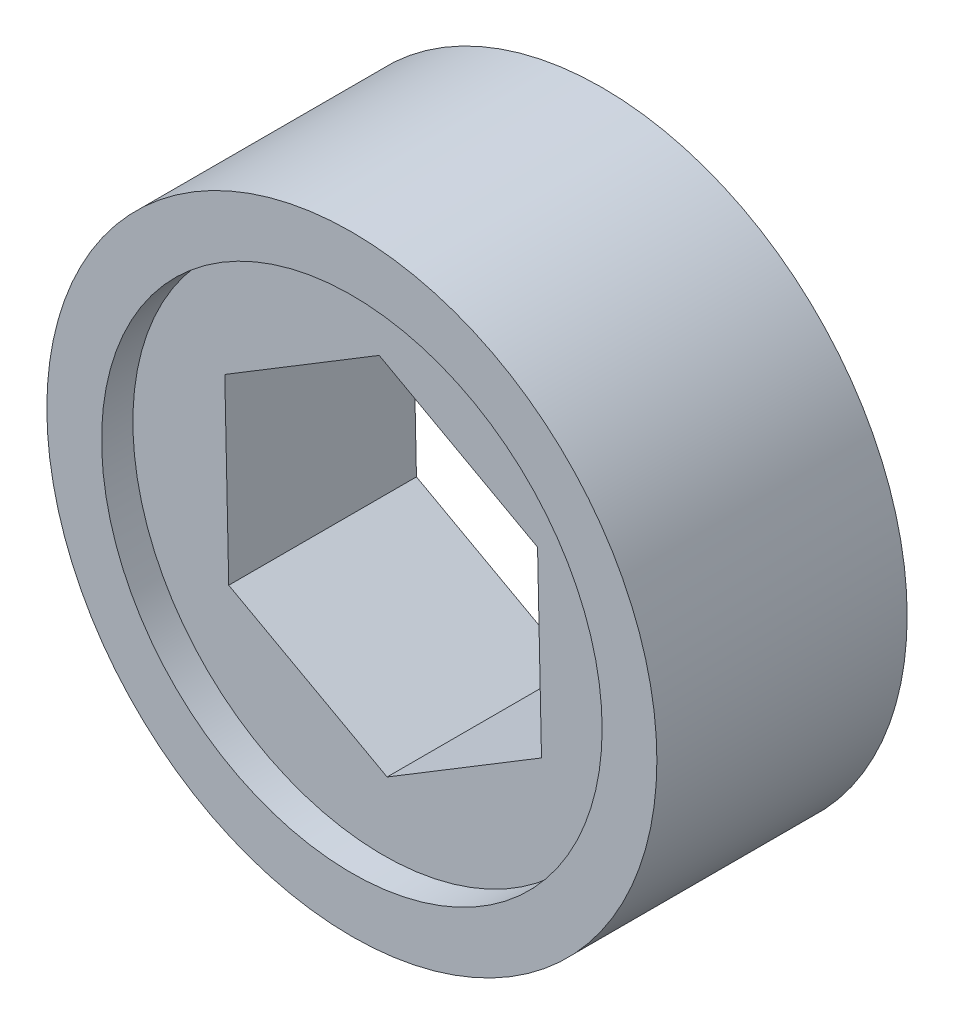
ISO-10303-21;
HEADER;
FILE_DESCRIPTION(('STEP AP214'),'2;1');
FILE_NAME('part.step','',(''),(''),'','','');
FILE_SCHEMA(('AUTOMOTIVE_DESIGN { 1 0 10303 214 1 1 1 1 }'));
ENDSEC;
DATA;
#1=APPLICATION_CONTEXT('core data for automotive mechanical design processes');
#2=APPLICATION_PROTOCOL_DEFINITION('international standard','automotive_design',2000,#1);
#3=PRODUCT_CONTEXT('',#1,'mechanical');
#4=PRODUCT('Part','Part','',(#3));
#5=PRODUCT_RELATED_PRODUCT_CATEGORY('part','',(#4));
#6=PRODUCT_DEFINITION_FORMATION('','',#4);
#7=PRODUCT_DEFINITION_CONTEXT('part definition',#1,'design');
#8=PRODUCT_DEFINITION('design','',#6,#7);
#9=PRODUCT_DEFINITION_SHAPE('','',#8);
#10=(LENGTH_UNIT() NAMED_UNIT(*) SI_UNIT(.MILLI.,.METRE.));
#11=(NAMED_UNIT(*) PLANE_ANGLE_UNIT() SI_UNIT($,.RADIAN.));
#12=(NAMED_UNIT(*) SI_UNIT($,.STERADIAN.) SOLID_ANGLE_UNIT());
#13=UNCERTAINTY_MEASURE_WITH_UNIT(LENGTH_MEASURE(1.E-05),#10,'distance_accuracy_value','');
#14=(GEOMETRIC_REPRESENTATION_CONTEXT(3) GLOBAL_UNCERTAINTY_ASSIGNED_CONTEXT((#13)) GLOBAL_UNIT_ASSIGNED_CONTEXT((#10,
#11,#12)) REPRESENTATION_CONTEXT('',''));
#15=CARTESIAN_POINT('',(0.,0.,0.));
#16=DIRECTION('',(0.,0.,1.));
#17=DIRECTION('',(1.,0.,0.));
#18=AXIS2_PLACEMENT_3D('',#15,#16,#17);
#19=CARTESIAN_POINT('',(-6.26830506406704,-3.80416678881528,10.16));
#20=DIRECTION('',(0.480941143051451,0.876752882470519,0.));
#21=DIRECTION('',(-0.876752882470519,0.480941143051451,0.));
#22=AXIS2_PLACEMENT_3D('',#19,#20,#21);
#23=PLANE('',#22);
#24=DIRECTION('',(0.,0.,-1.));
#25=VECTOR('',#24,1.);
#26=CARTESIAN_POINT('',(0.160352547313589,-7.33059481856034,10.16));
#27=LINE('',#26,#25);
#28=CARTESIAN_POINT('',(0.160352547313589,-7.33059481856034,8.89));
#29=VERTEX_POINT('',#28);
#30=CARTESIAN_POINT('',(0.160352547313589,-7.33059481856034,1.27));
#31=VERTEX_POINT('',#30);
#32=EDGE_CURVE('E96',#29,#31,#27,.T.);
#33=ORIENTED_EDGE('',*,*,#32,.T.);
#34=DIRECTION('',(-0.876752882470519,0.480941143051451,0.));
#35=VECTOR('',#34,1.);
#36=CARTESIAN_POINT('',(-6.26830506406704,-3.80416678881528,1.27));
#37=LINE('',#36,#35);
#38=CARTESIAN_POINT('',(-6.26830506406704,-3.80416678881528,1.27));
#39=VERTEX_POINT('',#38);
#40=EDGE_CURVE('E85',#31,#39,#37,.T.);
#41=ORIENTED_EDGE('',*,*,#40,.T.);
#42=DIRECTION('',(0.,0.,-1.));
#43=VECTOR('',#42,1.);
#44=CARTESIAN_POINT('',(-6.26830506406704,-3.80416678881528,10.16));
#45=LINE('',#44,#43);
#46=CARTESIAN_POINT('',(-6.26830506406704,-3.80416678881528,8.89));
#47=VERTEX_POINT('',#46);
#48=EDGE_CURVE('E94',#47,#39,#45,.T.);
#49=ORIENTED_EDGE('',*,*,#48,.F.);
#50=DIRECTION('',(0.876752882470519,-0.480941143051451,0.));
#51=VECTOR('',#50,1.);
#52=CARTESIAN_POINT('',(-6.26830506406704,-3.80416678881528,8.89));
#53=LINE('',#52,#51);
#54=EDGE_CURVE('E55',#47,#29,#53,.T.);
#55=ORIENTED_EDGE('',*,*,#54,.T.);
#56=EDGE_LOOP('',(#33,#41,#49,#55));
#57=FACE_BOUND('',#56,.T.);
#58=ADVANCED_FACE('F33',(#57),#23,.T.);
#59=CARTESIAN_POINT('',(0.160352547313589,-7.33059481856034,10.16));
#60=DIRECTION('',(-0.518819697534976,0.854883688842942,0.));
#61=DIRECTION('',(-0.854883688842942,-0.518819697534976,0.));
#62=AXIS2_PLACEMENT_3D('',#59,#60,#61);
#63=PLANE('',#62);
#64=DIRECTION('',(0.,0.,-1.));
#65=VECTOR('',#64,1.);
#66=CARTESIAN_POINT('',(6.42865761138062,-3.52642802974505,10.16));
#67=LINE('',#66,#65);
#68=CARTESIAN_POINT('',(6.42865761138062,-3.52642802974505,8.89));
#69=VERTEX_POINT('',#68);
#70=CARTESIAN_POINT('',(6.42865761138062,-3.52642802974505,1.27));
#71=VERTEX_POINT('',#70);
#72=EDGE_CURVE('E114',#69,#71,#67,.T.);
#73=ORIENTED_EDGE('',*,*,#72,.T.);
#74=DIRECTION('',(-0.854883688842942,-0.518819697534976,0.));
#75=VECTOR('',#74,1.);
#76=CARTESIAN_POINT('',(0.160352547313589,-7.33059481856034,1.27));
#77=LINE('',#76,#75);
#78=EDGE_CURVE('E98',#71,#31,#77,.T.);
#79=ORIENTED_EDGE('',*,*,#78,.T.);
#80=ORIENTED_EDGE('',*,*,#32,.F.);
#81=DIRECTION('',(0.854883688842942,0.518819697534976,0.));
#82=VECTOR('',#81,1.);
#83=CARTESIAN_POINT('',(0.160352547313589,-7.33059481856034,8.89));
#84=LINE('',#83,#82);
#85=EDGE_CURVE('E105',#29,#69,#84,.T.);
#86=ORIENTED_EDGE('',*,*,#85,.T.);
#87=EDGE_LOOP('',(#73,#79,#80,#86));
#88=FACE_BOUND('',#87,.T.);
#89=ADVANCED_FACE('F140',(#88),#63,.T.);
#90=CARTESIAN_POINT('',(6.42865761138062,-3.52642802974505,10.16));
#91=DIRECTION('',(-0.999760840586427,-0.0218691936275774,0.));
#92=DIRECTION('',(0.0218691936275774,-0.999760840586427,0.));
#93=AXIS2_PLACEMENT_3D('',#90,#91,#92);
#94=PLANE('',#93);
#95=DIRECTION('',(0.,0.,-1.));
#96=VECTOR('',#95,1.);
#97=CARTESIAN_POINT('',(6.26830506406703,3.80416678881529,10.16));
#98=LINE('',#97,#96);
#99=CARTESIAN_POINT('',(6.26830506406703,3.80416678881529,8.89));
#100=VERTEX_POINT('',#99);
#101=CARTESIAN_POINT('',(6.26830506406703,3.80416678881529,1.27));
#102=VERTEX_POINT('',#101);
#103=EDGE_CURVE('E111',#100,#102,#98,.T.);
#104=ORIENTED_EDGE('',*,*,#103,.T.);
#105=DIRECTION('',(0.0218691936275774,-0.999760840586427,0.));
#106=VECTOR('',#105,1.);
#107=CARTESIAN_POINT('',(6.42865761138062,-3.52642802974505,1.27));
#108=LINE('',#107,#106);
#109=EDGE_CURVE('E260',#102,#71,#108,.T.);
#110=ORIENTED_EDGE('',*,*,#109,.T.);
#111=ORIENTED_EDGE('',*,*,#72,.F.);
#112=DIRECTION('',(-0.0218691936275774,0.999760840586427,0.));
#113=VECTOR('',#112,1.);
#114=CARTESIAN_POINT('',(6.42865761138062,-3.52642802974505,8.89));
#115=LINE('',#114,#113);
#116=EDGE_CURVE('E275',#69,#100,#115,.T.);
#117=ORIENTED_EDGE('',*,*,#116,.T.);
#118=EDGE_LOOP('',(#104,#110,#111,#117));
#119=FACE_BOUND('',#118,.T.);
#120=ADVANCED_FACE('F145',(#119),#94,.T.);
#121=CARTESIAN_POINT('',(6.26830506406703,3.80416678881529,10.16));
#122=DIRECTION('',(-0.480941143051451,-0.876752882470519,0.));
#123=DIRECTION('',(0.876752882470519,-0.480941143051451,0.));
#124=AXIS2_PLACEMENT_3D('',#121,#122,#123);
#125=PLANE('',#124);
#126=DIRECTION('',(0.,0.,-1.));
#127=VECTOR('',#126,1.);
#128=CARTESIAN_POINT('',(-0.160352547313591,7.33059481856034,10.16));
#129=LINE('',#128,#127);
#130=CARTESIAN_POINT('',(-0.160352547313591,7.33059481856034,8.89));
#131=VERTEX_POINT('',#130);
#132=CARTESIAN_POINT('',(-0.160352547313591,7.33059481856034,1.27));
#133=VERTEX_POINT('',#132);
#134=EDGE_CURVE('E103',#131,#133,#129,.T.);
#135=ORIENTED_EDGE('',*,*,#134,.T.);
#136=DIRECTION('',(0.876752882470519,-0.480941143051451,0.));
#137=VECTOR('',#136,1.);
#138=CARTESIAN_POINT('',(6.26830506406703,3.80416678881529,1.27));
#139=LINE('',#138,#137);
#140=EDGE_CURVE('E257',#133,#102,#139,.T.);
#141=ORIENTED_EDGE('',*,*,#140,.T.);
#142=ORIENTED_EDGE('',*,*,#103,.F.);
#143=DIRECTION('',(-0.876752882470519,0.480941143051451,0.));
#144=VECTOR('',#143,1.);
#145=CARTESIAN_POINT('',(6.26830506406703,3.80416678881529,8.89));
#146=LINE('',#145,#144);
#147=EDGE_CURVE('E272',#100,#131,#146,.T.);
#148=ORIENTED_EDGE('',*,*,#147,.T.);
#149=EDGE_LOOP('',(#135,#141,#142,#148));
#150=FACE_BOUND('',#149,.T.);
#151=ADVANCED_FACE('F151',(#150),#125,.T.);
#152=CARTESIAN_POINT('',(-0.160352547313591,7.33059481856034,10.16));
#153=DIRECTION('',(0.518819697534976,-0.854883688842942,0.));
#154=DIRECTION('',(0.854883688842942,0.518819697534976,0.));
#155=AXIS2_PLACEMENT_3D('',#152,#153,#154);
#156=PLANE('',#155);
#157=DIRECTION('',(0.,0.,-1.));
#158=VECTOR('',#157,1.);
#159=CARTESIAN_POINT('',(-6.42865761138063,3.52642802974505,10.16));
#160=LINE('',#159,#158);
#161=CARTESIAN_POINT('',(-6.42865761138063,3.52642802974505,8.89));
#162=VERTEX_POINT('',#161);
#163=CARTESIAN_POINT('',(-6.42865761138063,3.52642802974505,1.27));
#164=VERTEX_POINT('',#163);
#165=EDGE_CURVE('E101',#162,#164,#160,.T.);
#166=ORIENTED_EDGE('',*,*,#165,.T.);
#167=DIRECTION('',(0.854883688842942,0.518819697534976,0.));
#168=VECTOR('',#167,1.);
#169=CARTESIAN_POINT('',(-0.160352547313591,7.33059481856034,1.27));
#170=LINE('',#169,#168);
#171=EDGE_CURVE('E48',#164,#133,#170,.T.);
#172=ORIENTED_EDGE('',*,*,#171,.T.);
#173=ORIENTED_EDGE('',*,*,#134,.F.);
#174=DIRECTION('',(-0.854883688842942,-0.518819697534976,0.));
#175=VECTOR('',#174,1.);
#176=CARTESIAN_POINT('',(-0.160352547313591,7.33059481856034,8.89));
#177=LINE('',#176,#175);
#178=EDGE_CURVE('E267',#131,#162,#177,.T.);
#179=ORIENTED_EDGE('',*,*,#178,.T.);
#180=EDGE_LOOP('',(#166,#172,#173,#179));
#181=FACE_BOUND('',#180,.T.);
#182=ADVANCED_FACE('F155',(#181),#156,.T.);
#183=CARTESIAN_POINT('',(-6.42865761138063,3.52642802974505,10.16));
#184=DIRECTION('',(0.999760840586427,0.0218691936275773,0.));
#185=DIRECTION('',(-0.0218691936275773,0.999760840586427,0.));
#186=AXIS2_PLACEMENT_3D('',#183,#184,#185);
#187=PLANE('',#186);
#188=ORIENTED_EDGE('',*,*,#48,.T.);
#189=DIRECTION('',(-0.0218691936275773,0.999760840586427,0.));
#190=VECTOR('',#189,1.);
#191=CARTESIAN_POINT('',(-6.42865761138063,3.52642802974505,1.27));
#192=LINE('',#191,#190);
#193=EDGE_CURVE('E11',#39,#164,#192,.T.);
#194=ORIENTED_EDGE('',*,*,#193,.T.);
#195=ORIENTED_EDGE('',*,*,#165,.F.);
#196=DIRECTION('',(0.0218691936275773,-0.999760840586427,0.));
#197=VECTOR('',#196,1.);
#198=CARTESIAN_POINT('',(-6.42865761138063,3.52642802974505,8.89));
#199=LINE('',#198,#197);
#200=EDGE_CURVE('E41',#162,#47,#199,.T.);
#201=ORIENTED_EDGE('',*,*,#200,.T.);
#202=EDGE_LOOP('',(#188,#194,#195,#201));
#203=FACE_BOUND('',#202,.T.);
#204=ADVANCED_FACE('F100',(#203),#187,.T.);
#205=CARTESIAN_POINT('',(0.,0.,10.16));
#206=DIRECTION('',(0.,0.,1.));
#207=DIRECTION('',(1.,0.,0.));
#208=AXIS2_PLACEMENT_3D('',#205,#206,#207);
#209=PLANE('',#208);
#210=CARTESIAN_POINT('',(0.,0.,10.16));
#211=DIRECTION('',(0.,0.,1.));
#212=DIRECTION('',(1.,0.,0.));
#213=AXIS2_PLACEMENT_3D('',#210,#211,#212);
#214=CIRCLE('',#213,10.16);
#215=CARTESIAN_POINT('',(10.16,0.,10.16));
#216=VERTEX_POINT('',#215);
#217=EDGE_CURVE('E97',#216,#216,#214,.T.);
#218=ORIENTED_EDGE('',*,*,#217,.F.);
#219=EDGE_LOOP('',(#218));
#220=FACE_BOUND('',#219,.T.);
#221=CARTESIAN_POINT('',(0.,0.,10.16));
#222=DIRECTION('',(0.,0.,1.));
#223=DIRECTION('',(1.,0.,0.));
#224=AXIS2_PLACEMENT_3D('',#221,#222,#223);
#225=CIRCLE('',#224,12.3825);
#226=CARTESIAN_POINT('',(12.3825,0.,10.16));
#227=VERTEX_POINT('',#226);
#228=EDGE_CURVE('E119',#227,#227,#225,.T.);
#229=ORIENTED_EDGE('',*,*,#228,.T.);
#230=EDGE_LOOP('',(#229));
#231=FACE_BOUND('',#230,.T.);
#232=ADVANCED_FACE('F128',(#220,#231),#209,.T.);
#233=CARTESIAN_POINT('',(0.,0.,0.));
#234=DIRECTION('',(0.,0.,1.));
#235=DIRECTION('',(1.,0.,0.));
#236=AXIS2_PLACEMENT_3D('',#233,#234,#235);
#237=PLANE('',#236);
#238=CARTESIAN_POINT('',(0.,0.,0.));
#239=DIRECTION('',(0.,0.,-1.));
#240=DIRECTION('',(-1.,0.,0.));
#241=AXIS2_PLACEMENT_3D('',#238,#239,#240);
#242=CIRCLE('',#241,10.16);
#243=CARTESIAN_POINT('',(-10.16,0.,0.));
#244=VERTEX_POINT('',#243);
#245=EDGE_CURVE('E252',#244,#244,#242,.T.);
#246=ORIENTED_EDGE('',*,*,#245,.F.);
#247=EDGE_LOOP('',(#246));
#248=FACE_BOUND('',#247,.T.);
#249=CARTESIAN_POINT('',(0.,0.,0.));
#250=DIRECTION('',(0.,0.,1.));
#251=DIRECTION('',(1.,0.,0.));
#252=AXIS2_PLACEMENT_3D('',#249,#250,#251);
#253=CIRCLE('',#252,12.3825);
#254=CARTESIAN_POINT('',(12.3825,0.,0.));
#255=VERTEX_POINT('',#254);
#256=EDGE_CURVE('E118',#255,#255,#253,.T.);
#257=ORIENTED_EDGE('',*,*,#256,.F.);
#258=EDGE_LOOP('',(#257));
#259=FACE_BOUND('',#258,.T.);
#260=ADVANCED_FACE('F126',(#248,#259),#237,.F.);
#261=CARTESIAN_POINT('',(0.,0.,10.16));
#262=DIRECTION('',(0.,0.,-1.));
#263=DIRECTION('',(-1.,0.,0.));
#264=AXIS2_PLACEMENT_3D('',#261,#262,#263);
#265=CYLINDRICAL_SURFACE('',#264,12.3825);
#266=ORIENTED_EDGE('',*,*,#228,.F.);
#267=EDGE_LOOP('',(#266));
#268=FACE_BOUND('',#267,.T.);
#269=ORIENTED_EDGE('',*,*,#256,.T.);
#270=EDGE_LOOP('',(#269));
#271=FACE_BOUND('',#270,.T.);
#272=ADVANCED_FACE('F35',(#268,#271),#265,.T.);
#273=CARTESIAN_POINT('',(0.,0.,8.89));
#274=DIRECTION('',(0.,0.,1.));
#275=DIRECTION('',(1.,0.,0.));
#276=AXIS2_PLACEMENT_3D('',#273,#274,#275);
#277=CYLINDRICAL_SURFACE('',#276,10.16);
#278=CARTESIAN_POINT('',(0.,0.,8.89));
#279=DIRECTION('',(0.,0.,1.));
#280=DIRECTION('',(1.,0.,0.));
#281=AXIS2_PLACEMENT_3D('',#278,#279,#280);
#282=CIRCLE('',#281,10.16);
#283=CARTESIAN_POINT('',(10.16,0.,8.89));
#284=VERTEX_POINT('',#283);
#285=EDGE_CURVE('E264',#284,#284,#282,.T.);
#286=ORIENTED_EDGE('',*,*,#285,.F.);
#287=EDGE_LOOP('',(#286));
#288=FACE_BOUND('',#287,.T.);
#289=ORIENTED_EDGE('',*,*,#217,.T.);
#290=EDGE_LOOP('',(#289));
#291=FACE_BOUND('',#290,.T.);
#292=ADVANCED_FACE('F134',(#288,#291),#277,.F.);
#293=CARTESIAN_POINT('',(0.,0.,8.89));
#294=DIRECTION('',(0.,0.,1.));
#295=DIRECTION('',(1.,0.,0.));
#296=AXIS2_PLACEMENT_3D('',#293,#294,#295);
#297=PLANE('',#296);
#298=ORIENTED_EDGE('',*,*,#200,.F.);
#299=ORIENTED_EDGE('',*,*,#178,.F.);
#300=ORIENTED_EDGE('',*,*,#147,.F.);
#301=ORIENTED_EDGE('',*,*,#116,.F.);
#302=ORIENTED_EDGE('',*,*,#85,.F.);
#303=ORIENTED_EDGE('',*,*,#54,.F.);
#304=EDGE_LOOP('',(#298,#299,#300,#301,#302,#303));
#305=FACE_BOUND('',#304,.T.);
#306=ORIENTED_EDGE('',*,*,#285,.T.);
#307=EDGE_LOOP('',(#306));
#308=FACE_BOUND('',#307,.T.);
#309=ADVANCED_FACE('F164',(#305,#308),#297,.T.);
#310=CARTESIAN_POINT('',(0.,0.,1.27));
#311=DIRECTION('',(0.,0.,-1.));
#312=DIRECTION('',(-1.,0.,0.));
#313=AXIS2_PLACEMENT_3D('',#310,#311,#312);
#314=CYLINDRICAL_SURFACE('',#313,10.16);
#315=CARTESIAN_POINT('',(0.,0.,1.27));
#316=DIRECTION('',(0.,0.,-1.));
#317=DIRECTION('',(-1.,0.,0.));
#318=AXIS2_PLACEMENT_3D('',#315,#316,#317);
#319=CIRCLE('',#318,10.16);
#320=CARTESIAN_POINT('',(-10.16,0.,1.27));
#321=VERTEX_POINT('',#320);
#322=EDGE_CURVE('E250',#321,#321,#319,.T.);
#323=ORIENTED_EDGE('',*,*,#322,.F.);
#324=EDGE_LOOP('',(#323));
#325=FACE_BOUND('',#324,.T.);
#326=ORIENTED_EDGE('',*,*,#245,.T.);
#327=EDGE_LOOP('',(#326));
#328=FACE_BOUND('',#327,.T.);
#329=ADVANCED_FACE('F168',(#325,#328),#314,.F.);
#330=CARTESIAN_POINT('',(0.,0.,1.27));
#331=DIRECTION('',(0.,0.,-1.));
#332=DIRECTION('',(-1.,0.,0.));
#333=AXIS2_PLACEMENT_3D('',#330,#331,#332);
#334=PLANE('',#333);
#335=ORIENTED_EDGE('',*,*,#78,.F.);
#336=ORIENTED_EDGE('',*,*,#109,.F.);
#337=ORIENTED_EDGE('',*,*,#140,.F.);
#338=ORIENTED_EDGE('',*,*,#171,.F.);
#339=ORIENTED_EDGE('',*,*,#193,.F.);
#340=ORIENTED_EDGE('',*,*,#40,.F.);
#341=EDGE_LOOP('',(#335,#336,#337,#338,#339,#340));
#342=FACE_BOUND('',#341,.T.);
#343=ORIENTED_EDGE('',*,*,#322,.T.);
#344=EDGE_LOOP('',(#343));
#345=FACE_BOUND('',#344,.T.);
#346=ADVANCED_FACE('F83',(#342,#345),#334,.T.);
#347=CLOSED_SHELL('',(#58,#89,#120,#151,#182,#204,#232,#260,#272,#292,#309,#329,#346));
#348=MANIFOLD_SOLID_BREP('B2',#347);
#349=ADVANCED_BREP_SHAPE_REPRESENTATION('',(#18,#348),#14);
#350=SHAPE_DEFINITION_REPRESENTATION(#9,#349);
ENDSEC;
END-ISO-10303-21;
